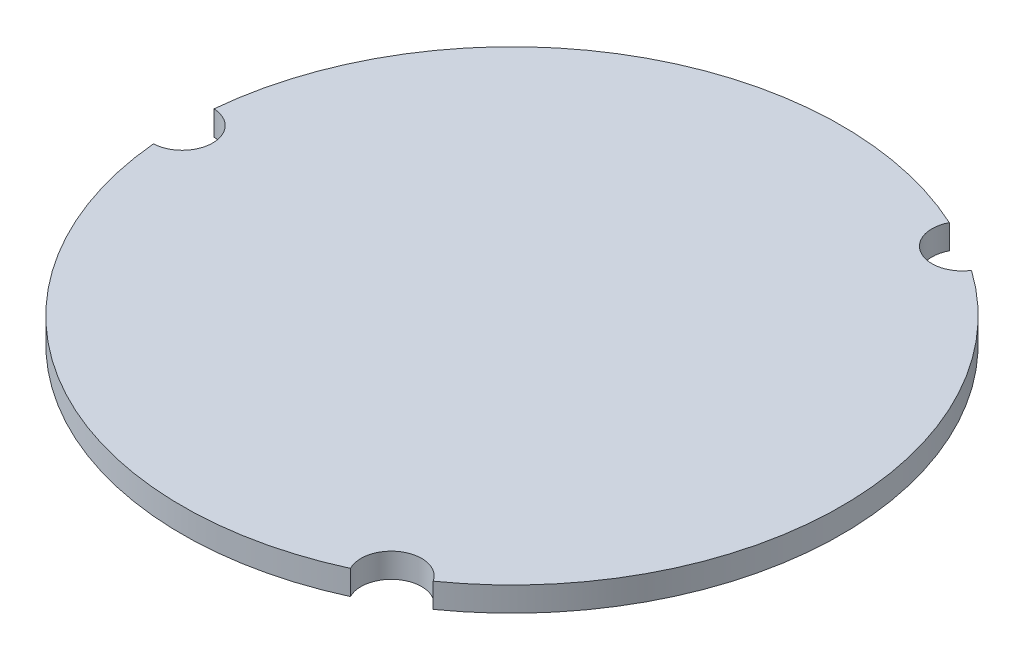
ISO-10303-21;
HEADER;
FILE_DESCRIPTION(('STEP AP214'),'2;1');
FILE_NAME('part.step','',(''),(''),'','','');
FILE_SCHEMA(('AUTOMOTIVE_DESIGN { 1 0 10303 214 1 1 1 1 }'));
ENDSEC;
DATA;
#1=APPLICATION_CONTEXT('core data for automotive mechanical design processes');
#2=APPLICATION_PROTOCOL_DEFINITION('international standard','automotive_design',2000,#1);
#3=PRODUCT_CONTEXT('',#1,'mechanical');
#4=PRODUCT('Part','Part','',(#3));
#5=PRODUCT_RELATED_PRODUCT_CATEGORY('part','',(#4));
#6=PRODUCT_DEFINITION_FORMATION('','',#4);
#7=PRODUCT_DEFINITION_CONTEXT('part definition',#1,'design');
#8=PRODUCT_DEFINITION('design','',#6,#7);
#9=PRODUCT_DEFINITION_SHAPE('','',#8);
#10=(LENGTH_UNIT() NAMED_UNIT(*) SI_UNIT(.MILLI.,.METRE.));
#11=(NAMED_UNIT(*) PLANE_ANGLE_UNIT() SI_UNIT($,.RADIAN.));
#12=(NAMED_UNIT(*) SI_UNIT($,.STERADIAN.) SOLID_ANGLE_UNIT());
#13=UNCERTAINTY_MEASURE_WITH_UNIT(LENGTH_MEASURE(1.E-05),#10,'distance_accuracy_value','');
#14=(GEOMETRIC_REPRESENTATION_CONTEXT(3) GLOBAL_UNCERTAINTY_ASSIGNED_CONTEXT((#13)) GLOBAL_UNIT_ASSIGNED_CONTEXT((#10,
#11,#12)) REPRESENTATION_CONTEXT('',''));
#15=CARTESIAN_POINT('',(0.,0.,0.));
#16=DIRECTION('',(0.,0.,1.));
#17=DIRECTION('',(1.,0.,0.));
#18=AXIS2_PLACEMENT_3D('',#15,#16,#17);
#19=CARTESIAN_POINT('',(0.,2.5,0.));
#20=DIRECTION('',(0.,-1.,0.));
#21=DIRECTION('',(0.,0.,-1.));
#22=AXIS2_PLACEMENT_3D('',#19,#20,#21);
#23=CYLINDRICAL_SURFACE('',#22,33.7);
#24=CARTESIAN_POINT('',(0.,0.,0.));
#25=DIRECTION('',(0.,1.,0.));
#26=DIRECTION('',(0.,0.,1.));
#27=AXIS2_PLACEMENT_3D('',#24,#25,#26);
#28=CIRCLE('',#27,33.7);
#29=CARTESIAN_POINT('',(19.4605467899059,0.,27.5132171626272));
#30=VERTEX_POINT('',#29);
#31=CARTESIAN_POINT('',(19.4605467899059,0.,-27.5132171626272));
#32=VERTEX_POINT('',#31);
#33=EDGE_CURVE('E125',#30,#32,#28,.T.);
#34=ORIENTED_EDGE('',*,*,#33,.T.);
#35=DIRECTION('',(0.,-1.,0.));
#36=VECTOR('',#35,1.);
#37=CARTESIAN_POINT('',(19.4605467899059,2.5,-27.5132171626272));
#38=LINE('',#37,#36);
#39=CARTESIAN_POINT('',(19.4605467899059,2.5,-27.5132171626272));
#40=VERTEX_POINT('',#39);
#41=EDGE_CURVE('E11',#40,#32,#38,.T.);
#42=ORIENTED_EDGE('',*,*,#41,.F.);
#43=CARTESIAN_POINT('',(0.,2.5,0.));
#44=DIRECTION('',(0.,1.,0.));
#45=DIRECTION('',(0.,0.,1.));
#46=AXIS2_PLACEMENT_3D('',#43,#44,#45);
#47=CIRCLE('',#46,33.7);
#48=CARTESIAN_POINT('',(19.4605467899059,2.5,27.5132171626272));
#49=VERTEX_POINT('',#48);
#50=EDGE_CURVE('E117',#49,#40,#47,.T.);
#51=ORIENTED_EDGE('',*,*,#50,.F.);
#52=DIRECTION('',(0.,-1.,0.));
#53=VECTOR('',#52,1.);
#54=CARTESIAN_POINT('',(19.4605467899059,2.5,27.5132171626272));
#55=LINE('',#54,#53);
#56=EDGE_CURVE('E118',#49,#30,#55,.T.);
#57=ORIENTED_EDGE('',*,*,#56,.T.);
#58=EDGE_LOOP('',(#34,#42,#51,#57));
#59=FACE_BOUND('',#58,.T.);
#60=ADVANCED_FACE('F36',(#59),#23,.T.);
#61=CARTESIAN_POINT('',(16.85,2.5,-29.1850561075356));
#62=DIRECTION('',(0.,-1.,0.));
#63=DIRECTION('',(0.,0.,-1.));
#64=AXIS2_PLACEMENT_3D('',#61,#62,#63);
#65=CYLINDRICAL_SURFACE('',#64,3.1);
#66=CARTESIAN_POINT('',(16.85,0.,-29.1850561075356));
#67=DIRECTION('',(0.,1.,0.));
#68=DIRECTION('',(0.,0.,1.));
#69=AXIS2_PLACEMENT_3D('',#66,#67,#68);
#70=CIRCLE('',#69,3.1);
#71=CARTESIAN_POINT('',(14.0968716077202,0.,-30.6099364729078));
#72=VERTEX_POINT('',#71);
#73=EDGE_CURVE('E139',#32,#72,#70,.F.);
#74=ORIENTED_EDGE('',*,*,#73,.T.);
#75=DIRECTION('',(0.,-1.,0.));
#76=VECTOR('',#75,1.);
#77=CARTESIAN_POINT('',(14.0968716077202,2.5,-30.6099364729078));
#78=LINE('',#77,#76);
#79=CARTESIAN_POINT('',(14.0968716077202,2.5,-30.6099364729078));
#80=VERTEX_POINT('',#79);
#81=EDGE_CURVE('E45',#80,#72,#78,.T.);
#82=ORIENTED_EDGE('',*,*,#81,.F.);
#83=CARTESIAN_POINT('',(16.85,2.5,-29.1850561075356));
#84=DIRECTION('',(0.,1.,0.));
#85=DIRECTION('',(0.,0.,1.));
#86=AXIS2_PLACEMENT_3D('',#83,#84,#85);
#87=CIRCLE('',#86,3.1);
#88=EDGE_CURVE('E90',#40,#80,#87,.F.);
#89=ORIENTED_EDGE('',*,*,#88,.F.);
#90=ORIENTED_EDGE('',*,*,#41,.T.);
#91=EDGE_LOOP('',(#74,#82,#89,#90));
#92=FACE_BOUND('',#91,.T.);
#93=ADVANCED_FACE('F38',(#92),#65,.F.);
#94=CARTESIAN_POINT('',(0.,2.5,0.));
#95=DIRECTION('',(0.,-1.,0.));
#96=DIRECTION('',(0.,0.,-1.));
#97=AXIS2_PLACEMENT_3D('',#94,#95,#96);
#98=CYLINDRICAL_SURFACE('',#97,33.7);
#99=CARTESIAN_POINT('',(0.,0.,0.));
#100=DIRECTION('',(0.,1.,0.));
#101=DIRECTION('',(0.,0.,1.));
#102=AXIS2_PLACEMENT_3D('',#99,#100,#101);
#103=CIRCLE('',#102,33.7);
#104=CARTESIAN_POINT('',(-33.5574183976261,0.,-3.09671931028057));
#105=VERTEX_POINT('',#104);
#106=EDGE_CURVE('E135',#72,#105,#103,.T.);
#107=ORIENTED_EDGE('',*,*,#106,.T.);
#108=DIRECTION('',(0.,-1.,0.));
#109=VECTOR('',#108,1.);
#110=CARTESIAN_POINT('',(-33.5574183976261,2.5,-3.09671931028057));
#111=LINE('',#110,#109);
#112=CARTESIAN_POINT('',(-33.5574183976261,2.5,-3.09671931028057));
#113=VERTEX_POINT('',#112);
#114=EDGE_CURVE('E112',#113,#105,#111,.T.);
#115=ORIENTED_EDGE('',*,*,#114,.F.);
#116=CARTESIAN_POINT('',(0.,2.5,0.));
#117=DIRECTION('',(0.,1.,0.));
#118=DIRECTION('',(0.,0.,1.));
#119=AXIS2_PLACEMENT_3D('',#116,#117,#118);
#120=CIRCLE('',#119,33.7);
#121=EDGE_CURVE('E103',#80,#113,#120,.T.);
#122=ORIENTED_EDGE('',*,*,#121,.F.);
#123=ORIENTED_EDGE('',*,*,#81,.T.);
#124=EDGE_LOOP('',(#107,#115,#122,#123));
#125=FACE_BOUND('',#124,.T.);
#126=ADVANCED_FACE('F134',(#125),#98,.T.);
#127=CARTESIAN_POINT('',(-33.7,2.5,0.));
#128=DIRECTION('',(0.,-1.,0.));
#129=DIRECTION('',(0.,0.,-1.));
#130=AXIS2_PLACEMENT_3D('',#127,#128,#129);
#131=CYLINDRICAL_SURFACE('',#130,3.1);
#132=CARTESIAN_POINT('',(-33.7,0.,0.));
#133=DIRECTION('',(0.,1.,0.));
#134=DIRECTION('',(0.,0.,1.));
#135=AXIS2_PLACEMENT_3D('',#132,#133,#134);
#136=CIRCLE('',#135,3.1);
#137=CARTESIAN_POINT('',(-33.5574183976261,0.,3.09671931028058));
#138=VERTEX_POINT('',#137);
#139=EDGE_CURVE('E111',#105,#138,#136,.F.);
#140=ORIENTED_EDGE('',*,*,#139,.T.);
#141=DIRECTION('',(0.,-1.,0.));
#142=VECTOR('',#141,1.);
#143=CARTESIAN_POINT('',(-33.5574183976261,2.5,3.09671931028058));
#144=LINE('',#143,#142);
#145=CARTESIAN_POINT('',(-33.5574183976261,2.5,3.09671931028058));
#146=VERTEX_POINT('',#145);
#147=EDGE_CURVE('E108',#146,#138,#144,.T.);
#148=ORIENTED_EDGE('',*,*,#147,.F.);
#149=CARTESIAN_POINT('',(-33.7,2.5,0.));
#150=DIRECTION('',(0.,1.,0.));
#151=DIRECTION('',(0.,0.,1.));
#152=AXIS2_PLACEMENT_3D('',#149,#150,#151);
#153=CIRCLE('',#152,3.1);
#154=EDGE_CURVE('E97',#113,#146,#153,.F.);
#155=ORIENTED_EDGE('',*,*,#154,.F.);
#156=ORIENTED_EDGE('',*,*,#114,.T.);
#157=EDGE_LOOP('',(#140,#148,#155,#156));
#158=FACE_BOUND('',#157,.T.);
#159=ADVANCED_FACE('F109',(#158),#131,.F.);
#160=CARTESIAN_POINT('',(14.0968716077203,0.,30.6099364729078));
#161=VERTEX_POINT('',#160);
#162=EDGE_CURVE('E76',#138,#161,#28,.T.);
#163=ORIENTED_EDGE('',*,*,#162,.T.);
#164=DIRECTION('',(0.,-1.,0.));
#165=VECTOR('',#164,1.);
#166=CARTESIAN_POINT('',(14.0968716077203,2.5,30.6099364729078));
#167=LINE('',#166,#165);
#168=CARTESIAN_POINT('',(14.0968716077203,2.5,30.6099364729078));
#169=VERTEX_POINT('',#168);
#170=EDGE_CURVE('E113',#169,#161,#167,.T.);
#171=ORIENTED_EDGE('',*,*,#170,.F.);
#172=EDGE_CURVE('E101',#146,#169,#47,.T.);
#173=ORIENTED_EDGE('',*,*,#172,.F.);
#174=ORIENTED_EDGE('',*,*,#147,.T.);
#175=EDGE_LOOP('',(#163,#171,#173,#174));
#176=FACE_BOUND('',#175,.T.);
#177=ADVANCED_FACE('F115',(#176),#23,.T.);
#178=CARTESIAN_POINT('',(16.85,2.5,29.1850561075356));
#179=DIRECTION('',(0.,-1.,0.));
#180=DIRECTION('',(0.,0.,-1.));
#181=AXIS2_PLACEMENT_3D('',#178,#179,#180);
#182=CYLINDRICAL_SURFACE('',#181,3.1);
#183=CARTESIAN_POINT('',(16.85,0.,29.1850561075356));
#184=DIRECTION('',(0.,1.,0.));
#185=DIRECTION('',(0.,0.,1.));
#186=AXIS2_PLACEMENT_3D('',#183,#184,#185);
#187=CIRCLE('',#186,3.1);
#188=EDGE_CURVE('E82',#161,#30,#187,.F.);
#189=ORIENTED_EDGE('',*,*,#188,.T.);
#190=ORIENTED_EDGE('',*,*,#56,.F.);
#191=CARTESIAN_POINT('',(16.85,2.5,29.1850561075356));
#192=DIRECTION('',(0.,1.,0.));
#193=DIRECTION('',(0.,0.,1.));
#194=AXIS2_PLACEMENT_3D('',#191,#192,#193);
#195=CIRCLE('',#194,3.1);
#196=EDGE_CURVE('E53',#169,#49,#195,.F.);
#197=ORIENTED_EDGE('',*,*,#196,.F.);
#198=ORIENTED_EDGE('',*,*,#170,.T.);
#199=EDGE_LOOP('',(#189,#190,#197,#198));
#200=FACE_BOUND('',#199,.T.);
#201=ADVANCED_FACE('F144',(#200),#182,.F.);
#202=CARTESIAN_POINT('',(0.,2.5,0.));
#203=DIRECTION('',(0.,1.,0.));
#204=DIRECTION('',(0.,0.,1.));
#205=AXIS2_PLACEMENT_3D('',#202,#203,#204);
#206=PLANE('',#205);
#207=ORIENTED_EDGE('',*,*,#50,.T.);
#208=ORIENTED_EDGE('',*,*,#88,.T.);
#209=ORIENTED_EDGE('',*,*,#121,.T.);
#210=ORIENTED_EDGE('',*,*,#154,.T.);
#211=ORIENTED_EDGE('',*,*,#172,.T.);
#212=ORIENTED_EDGE('',*,*,#196,.T.);
#213=EDGE_LOOP('',(#207,#208,#209,#210,#211,#212));
#214=FACE_BOUND('',#213,.T.);
#215=ADVANCED_FACE('F99',(#214),#206,.T.);
#216=CARTESIAN_POINT('',(0.,0.,0.));
#217=DIRECTION('',(0.,1.,0.));
#218=DIRECTION('',(0.,0.,1.));
#219=AXIS2_PLACEMENT_3D('',#216,#217,#218);
#220=PLANE('',#219);
#221=ORIENTED_EDGE('',*,*,#33,.F.);
#222=ORIENTED_EDGE('',*,*,#188,.F.);
#223=ORIENTED_EDGE('',*,*,#162,.F.);
#224=ORIENTED_EDGE('',*,*,#139,.F.);
#225=ORIENTED_EDGE('',*,*,#106,.F.);
#226=ORIENTED_EDGE('',*,*,#73,.F.);
#227=EDGE_LOOP('',(#221,#222,#223,#224,#225,#226));
#228=FACE_BOUND('',#227,.T.);
#229=ADVANCED_FACE('F138',(#228),#220,.F.);
#230=CLOSED_SHELL('',(#60,#93,#126,#159,#177,#201,#215,#229));
#231=MANIFOLD_SOLID_BREP('B2',#230);
#232=ADVANCED_BREP_SHAPE_REPRESENTATION('',(#18,#231),#14);
#233=SHAPE_DEFINITION_REPRESENTATION(#9,#232);
ENDSEC;
END-ISO-10303-21;
